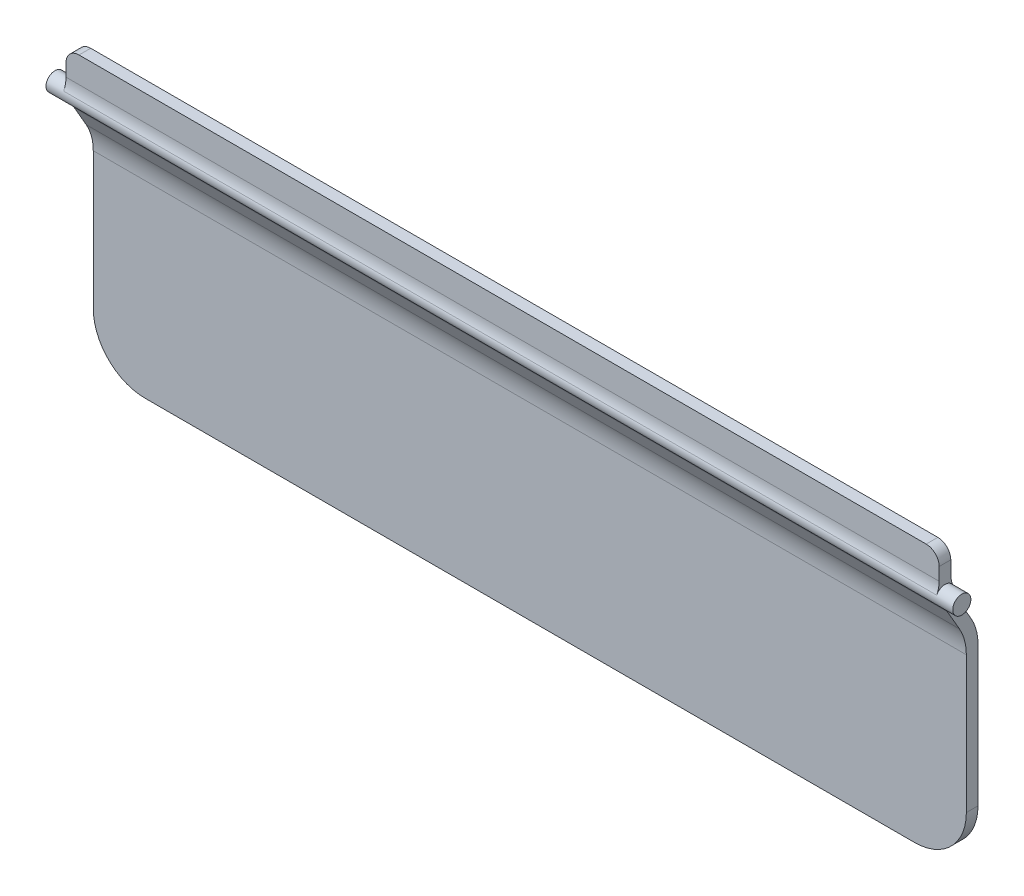
ISO-10303-21;
HEADER;
FILE_DESCRIPTION(('STEP AP214'),'2;1');
FILE_NAME('part.step','',(''),(''),'','','');
FILE_SCHEMA(('AUTOMOTIVE_DESIGN { 1 0 10303 214 1 1 1 1 }'));
ENDSEC;
DATA;
#1=APPLICATION_CONTEXT('core data for automotive mechanical design processes');
#2=APPLICATION_PROTOCOL_DEFINITION('international standard','automotive_design',2000,#1);
#3=PRODUCT_CONTEXT('',#1,'mechanical');
#4=PRODUCT('Part','Part','',(#3));
#5=PRODUCT_RELATED_PRODUCT_CATEGORY('part','',(#4));
#6=PRODUCT_DEFINITION_FORMATION('','',#4);
#7=PRODUCT_DEFINITION_CONTEXT('part definition',#1,'design');
#8=PRODUCT_DEFINITION('design','',#6,#7);
#9=PRODUCT_DEFINITION_SHAPE('','',#8);
#10=(LENGTH_UNIT() NAMED_UNIT(*) SI_UNIT(.MILLI.,.METRE.));
#11=(NAMED_UNIT(*) PLANE_ANGLE_UNIT() SI_UNIT($,.RADIAN.));
#12=(NAMED_UNIT(*) SI_UNIT($,.STERADIAN.) SOLID_ANGLE_UNIT());
#13=UNCERTAINTY_MEASURE_WITH_UNIT(LENGTH_MEASURE(1.E-05),#10,'distance_accuracy_value','');
#14=(GEOMETRIC_REPRESENTATION_CONTEXT(3) GLOBAL_UNCERTAINTY_ASSIGNED_CONTEXT((#13)) GLOBAL_UNIT_ASSIGNED_CONTEXT((#10,
#11,#12)) REPRESENTATION_CONTEXT('',''));
#15=CARTESIAN_POINT('',(0.,0.,0.));
#16=DIRECTION('',(0.,0.,1.));
#17=DIRECTION('',(1.,0.,0.));
#18=AXIS2_PLACEMENT_3D('',#15,#16,#17);
#19=CARTESIAN_POINT('',(168.5,22.5442286340599,7.49999999999999));
#20=DIRECTION('',(0.,0.500000000000001,-0.866025403784438));
#21=DIRECTION('',(0.,0.866025403784438,0.500000000000001));
#22=AXIS2_PLACEMENT_3D('',#19,#20,#21);
#23=PLANE('',#22);
#24=DIRECTION('',(0.,-0.866025403784438,-0.500000000000001));
#25=VECTOR('',#24,1.);
#26=CARTESIAN_POINT('',(168.5,22.5442286340599,7.49999999999999));
#27=LINE('',#26,#25);
#28=CARTESIAN_POINT('',(168.5,17.1088033152716,4.36185572903742));
#29=VERTEX_POINT('',#28);
#30=CARTESIAN_POINT('',(168.5,8.99871130596436,-0.320508075688754));
#31=VERTEX_POINT('',#30);
#32=EDGE_CURVE('E406',#29,#31,#27,.T.);
#33=ORIENTED_EDGE('',*,*,#32,.F.);
#34=DIRECTION('',(1.,0.,0.));
#35=VECTOR('',#34,1.);
#36=CARTESIAN_POINT('',(-168.5,17.1088033152716,4.36185572903742));
#37=LINE('',#36,#35);
#38=CARTESIAN_POINT('',(-168.5,17.1088033152716,4.36185572903742));
#39=VERTEX_POINT('',#38);
#40=EDGE_CURVE('E313',#29,#39,#37,.F.);
#41=ORIENTED_EDGE('',*,*,#40,.T.);
#42=DIRECTION('',(0.,-0.866025403784438,-0.500000000000001));
#43=VECTOR('',#42,1.);
#44=CARTESIAN_POINT('',(-168.5,22.5442286340599,7.49999999999999));
#45=LINE('',#44,#43);
#46=CARTESIAN_POINT('',(-168.5,8.99871130596436,-0.320508075688754));
#47=VERTEX_POINT('',#46);
#48=EDGE_CURVE('E217',#39,#47,#45,.T.);
#49=ORIENTED_EDGE('',*,*,#48,.T.);
#50=DIRECTION('',(-1.,0.,0.));
#51=VECTOR('',#50,1.);
#52=CARTESIAN_POINT('',(168.5,8.99871130596435,-0.320508075688753));
#53=LINE('',#52,#51);
#54=EDGE_CURVE('E191',#47,#31,#53,.F.);
#55=ORIENTED_EDGE('',*,*,#54,.T.);
#56=EDGE_LOOP('',(#33,#41,#49,#55));
#57=FACE_BOUND('',#56,.T.);
#58=ADVANCED_FACE('F45',(#57),#23,.F.);
#59=CARTESIAN_POINT('',(168.5,5.56346652052678,-7.50000000000004));
#60=DIRECTION('',(0.,-0.500000000000001,0.866025403784438));
#61=DIRECTION('',(0.,-0.866025403784438,-0.500000000000001));
#62=AXIS2_PLACEMENT_3D('',#59,#60,#61);
#63=PLANE('',#62);
#64=DIRECTION('',(0.,0.866025403784438,0.500000000000001));
#65=VECTOR('',#64,1.);
#66=CARTESIAN_POINT('',(-168.5,5.56346652052678,-7.50000000000004));
#67=LINE('',#66,#65);
#68=CARTESIAN_POINT('',(-168.5,10.2044826719043,-4.8205080756888));
#69=VERTEX_POINT('',#68);
#70=CARTESIAN_POINT('',(-168.5,19.3588033152716,0.464741412007454));
#71=VERTEX_POINT('',#70);
#72=EDGE_CURVE('E223',#69,#71,#67,.T.);
#73=ORIENTED_EDGE('',*,*,#72,.T.);
#74=DIRECTION('',(1.,0.,0.));
#75=VECTOR('',#74,1.);
#76=CARTESIAN_POINT('',(168.5,19.3588033152716,0.464741412007454));
#77=LINE('',#76,#75);
#78=CARTESIAN_POINT('',(168.5,19.3588033152716,0.464741412007454));
#79=VERTEX_POINT('',#78);
#80=EDGE_CURVE('E316',#71,#79,#77,.T.);
#81=ORIENTED_EDGE('',*,*,#80,.T.);
#82=DIRECTION('',(0.,0.866025403784438,0.500000000000001));
#83=VECTOR('',#82,1.);
#84=CARTESIAN_POINT('',(168.5,5.56346652052678,-7.50000000000004));
#85=LINE('',#84,#83);
#86=CARTESIAN_POINT('',(168.5,10.2044826719043,-4.8205080756888));
#87=VERTEX_POINT('',#86);
#88=EDGE_CURVE('E414',#87,#79,#85,.T.);
#89=ORIENTED_EDGE('',*,*,#88,.F.);
#90=DIRECTION('',(-1.,0.,0.));
#91=VECTOR('',#90,1.);
#92=CARTESIAN_POINT('',(168.5,10.2044826719043,-4.8205080756888));
#93=LINE('',#92,#91);
#94=EDGE_CURVE('E258',#87,#69,#93,.T.);
#95=ORIENTED_EDGE('',*,*,#94,.T.);
#96=EDGE_LOOP('',(#73,#81,#89,#95));
#97=FACE_BOUND('',#96,.T.);
#98=ADVANCED_FACE('F446',(#97),#63,.F.);
#99=CARTESIAN_POINT('',(168.5,0.,0.));
#100=DIRECTION('',(1.,0.,0.));
#101=DIRECTION('',(0.,0.,-1.));
#102=AXIS2_PLACEMENT_3D('',#99,#100,#101);
#103=PLANE('',#102);
#104=DIRECTION('',(0.,1.,0.));
#105=VECTOR('',#104,1.);
#106=CARTESIAN_POINT('',(168.5,-73.75,-7.5));
#107=LINE('',#106,#105);
#108=CARTESIAN_POINT('',(168.5,-53.75,-7.50000000000001));
#109=VERTEX_POINT('',#108);
#110=CARTESIAN_POINT('',(168.5,0.204482671904302,-7.50000000000003));
#111=VERTEX_POINT('',#110);
#112=EDGE_CURVE('E410',#109,#111,#107,.T.);
#113=ORIENTED_EDGE('',*,*,#112,.T.);
#114=CARTESIAN_POINT('',(168.5,0.204482671904307,12.5));
#115=DIRECTION('',(1.,0.,0.));
#116=DIRECTION('',(0.,0.,-1.));
#117=AXIS2_PLACEMENT_3D('',#114,#115,#116);
#118=CIRCLE('',#117,20.);
#119=EDGE_CURVE('E279',#111,#87,#118,.T.);
#120=ORIENTED_EDGE('',*,*,#119,.T.);
#121=ORIENTED_EDGE('',*,*,#88,.T.);
#122=CARTESIAN_POINT('',(168.5,24.3588033152716,-8.19551262583693));
#123=DIRECTION('',(1.,0.,0.));
#124=DIRECTION('',(0.,0.,-1.));
#125=AXIS2_PLACEMENT_3D('',#122,#123,#124);
#126=CIRCLE('',#125,10.);
#127=CARTESIAN_POINT('',(168.5,23.4612559091667,1.7641263562645));
#128=VERTEX_POINT('',#127);
#129=EDGE_CURVE('E339',#79,#128,#126,.F.);
#130=ORIENTED_EDGE('',*,*,#129,.T.);
#131=CARTESIAN_POINT('',(168.5,23.14711431703,5.25));
#132=DIRECTION('',(1.,0.,0.));
#133=DIRECTION('',(0.,0.,-1.));
#134=AXIS2_PLACEMENT_3D('',#131,#132,#133);
#135=CIRCLE('',#134,3.5);
#136=CARTESIAN_POINT('',(168.5,20.2853299832408,7.26499142104343));
#137=VERTEX_POINT('',#136);
#138=EDGE_CURVE('E382',#128,#137,#135,.F.);
#139=ORIENTED_EDGE('',*,*,#138,.T.);
#140=CARTESIAN_POINT('',(168.5,12.1088033152716,13.0221097668818));
#141=DIRECTION('',(1.,0.,0.));
#142=DIRECTION('',(0.,0.,-1.));
#143=AXIS2_PLACEMENT_3D('',#140,#141,#142);
#144=CIRCLE('',#143,10.);
#145=EDGE_CURVE('E330',#137,#29,#144,.F.);
#146=ORIENTED_EDGE('',*,*,#145,.T.);
#147=ORIENTED_EDGE('',*,*,#32,.T.);
#148=CARTESIAN_POINT('',(168.5,-1.00128869403567,17.));
#149=DIRECTION('',(1.,0.,0.));
#150=DIRECTION('',(0.,0.,-1.));
#151=AXIS2_PLACEMENT_3D('',#148,#149,#150);
#152=CIRCLE('',#151,20.);
#153=CARTESIAN_POINT('',(168.5,-1.00128869403567,-2.99999999999999));
#154=VERTEX_POINT('',#153);
#155=EDGE_CURVE('E196',#31,#154,#152,.F.);
#156=ORIENTED_EDGE('',*,*,#155,.T.);
#157=DIRECTION('',(0.,-1.,0.));
#158=VECTOR('',#157,1.);
#159=CARTESIAN_POINT('',(168.5,4.35769515458681,-2.99999999999999));
#160=LINE('',#159,#158);
#161=CARTESIAN_POINT('',(168.5,-53.75,-3.));
#162=VERTEX_POINT('',#161);
#163=EDGE_CURVE('E206',#154,#162,#160,.T.);
#164=ORIENTED_EDGE('',*,*,#163,.T.);
#165=DIRECTION('',(0.,0.,-1.));
#166=VECTOR('',#165,1.);
#167=CARTESIAN_POINT('',(168.5,-53.75,-7.5));
#168=LINE('',#167,#166);
#169=EDGE_CURVE('E275',#162,#109,#168,.T.);
#170=ORIENTED_EDGE('',*,*,#169,.T.);
#171=EDGE_LOOP('',(#113,#120,#121,#130,#139,#146,#147,#156,#164,#170));
#172=FACE_BOUND('',#171,.T.);
#173=ADVANCED_FACE('F451',(#172),#103,.T.);
#174=CARTESIAN_POINT('',(-168.5,0.,0.));
#175=DIRECTION('',(1.,0.,0.));
#176=DIRECTION('',(0.,0.,-1.));
#177=AXIS2_PLACEMENT_3D('',#174,#175,#176);
#178=PLANE('',#177);
#179=ORIENTED_EDGE('',*,*,#72,.F.);
#180=CARTESIAN_POINT('',(-168.5,0.204482671904307,12.5));
#181=DIRECTION('',(1.,0.,0.));
#182=DIRECTION('',(0.,0.,-1.));
#183=AXIS2_PLACEMENT_3D('',#180,#181,#182);
#184=CIRCLE('',#183,20.);
#185=CARTESIAN_POINT('',(-168.5,0.204482671904302,-7.50000000000003));
#186=VERTEX_POINT('',#185);
#187=EDGE_CURVE('E264',#69,#186,#184,.F.);
#188=ORIENTED_EDGE('',*,*,#187,.T.);
#189=DIRECTION('',(0.,1.,0.));
#190=VECTOR('',#189,1.);
#191=CARTESIAN_POINT('',(-168.5,-73.75,-7.5));
#192=LINE('',#191,#190);
#193=CARTESIAN_POINT('',(-168.5,-53.75,-7.50000000000001));
#194=VERTEX_POINT('',#193);
#195=EDGE_CURVE('E216',#194,#186,#192,.T.);
#196=ORIENTED_EDGE('',*,*,#195,.F.);
#197=DIRECTION('',(0.,0.,-1.));
#198=VECTOR('',#197,1.);
#199=CARTESIAN_POINT('',(-168.5,-53.75,0.));
#200=LINE('',#199,#198);
#201=CARTESIAN_POINT('',(-168.5,-53.75,-3.));
#202=VERTEX_POINT('',#201);
#203=EDGE_CURVE('E214',#194,#202,#200,.F.);
#204=ORIENTED_EDGE('',*,*,#203,.T.);
#205=DIRECTION('',(0.,-1.,0.));
#206=VECTOR('',#205,1.);
#207=CARTESIAN_POINT('',(-168.5,4.35769515458681,-2.99999999999999));
#208=LINE('',#207,#206);
#209=CARTESIAN_POINT('',(-168.5,-1.00128869403567,-2.99999999999999));
#210=VERTEX_POINT('',#209);
#211=EDGE_CURVE('E203',#210,#202,#208,.T.);
#212=ORIENTED_EDGE('',*,*,#211,.F.);
#213=CARTESIAN_POINT('',(-168.5,-1.00128869403567,17.));
#214=DIRECTION('',(1.,0.,0.));
#215=DIRECTION('',(0.,0.,-1.));
#216=AXIS2_PLACEMENT_3D('',#213,#214,#215);
#217=CIRCLE('',#216,20.);
#218=EDGE_CURVE('E185',#210,#47,#217,.T.);
#219=ORIENTED_EDGE('',*,*,#218,.T.);
#220=ORIENTED_EDGE('',*,*,#48,.F.);
#221=CARTESIAN_POINT('',(-168.5,12.1088033152716,13.0221097668818));
#222=DIRECTION('',(1.,0.,0.));
#223=DIRECTION('',(0.,0.,-1.));
#224=AXIS2_PLACEMENT_3D('',#221,#222,#223);
#225=CIRCLE('',#224,10.);
#226=CARTESIAN_POINT('',(-168.5,20.2853299832408,7.26499142104343));
#227=VERTEX_POINT('',#226);
#228=EDGE_CURVE('E332',#39,#227,#225,.T.);
#229=ORIENTED_EDGE('',*,*,#228,.T.);
#230=CARTESIAN_POINT('',(-168.5,23.14711431703,5.25));
#231=DIRECTION('',(1.,0.,0.));
#232=DIRECTION('',(0.,0.,-1.));
#233=AXIS2_PLACEMENT_3D('',#230,#231,#232);
#234=CIRCLE('',#233,3.5);
#235=CARTESIAN_POINT('',(-168.5,23.4612559091667,1.7641263562645));
#236=VERTEX_POINT('',#235);
#237=EDGE_CURVE('E250',#236,#227,#234,.F.);
#238=ORIENTED_EDGE('',*,*,#237,.F.);
#239=CARTESIAN_POINT('',(-168.5,24.3588033152716,-8.19551262583693));
#240=DIRECTION('',(1.,0.,0.));
#241=DIRECTION('',(0.,0.,-1.));
#242=AXIS2_PLACEMENT_3D('',#239,#240,#241);
#243=CIRCLE('',#242,10.);
#244=EDGE_CURVE('E336',#236,#71,#243,.T.);
#245=ORIENTED_EDGE('',*,*,#244,.T.);
#246=EDGE_LOOP('',(#179,#188,#196,#204,#212,#219,#220,#229,#238,#245));
#247=FACE_BOUND('',#246,.T.);
#248=ADVANCED_FACE('F211',(#247),#178,.F.);
#249=CARTESIAN_POINT('',(168.5,4.35769515458681,-2.99999999999999));
#250=DIRECTION('',(0.,0.,-1.));
#251=DIRECTION('',(0.,1.,0.));
#252=AXIS2_PLACEMENT_3D('',#249,#250,#251);
#253=PLANE('',#252);
#254=ORIENTED_EDGE('',*,*,#163,.F.);
#255=DIRECTION('',(-1.,0.,0.));
#256=VECTOR('',#255,1.);
#257=CARTESIAN_POINT('',(-168.5,-1.00128869403567,-2.99999999999999));
#258=LINE('',#257,#256);
#259=EDGE_CURVE('E189',#154,#210,#258,.T.);
#260=ORIENTED_EDGE('',*,*,#259,.T.);
#261=ORIENTED_EDGE('',*,*,#211,.T.);
#262=CARTESIAN_POINT('',(-148.5,-53.75,-3.));
#263=DIRECTION('',(0.,0.,-1.));
#264=DIRECTION('',(0.,1.,0.));
#265=AXIS2_PLACEMENT_3D('',#262,#263,#264);
#266=CIRCLE('',#265,20.);
#267=CARTESIAN_POINT('',(-148.5,-73.75,-3.));
#268=VERTEX_POINT('',#267);
#269=EDGE_CURVE('E251',#202,#268,#266,.F.);
#270=ORIENTED_EDGE('',*,*,#269,.T.);
#271=DIRECTION('',(-1.,0.,0.));
#272=VECTOR('',#271,1.);
#273=CARTESIAN_POINT('',(168.5,-73.75,-3.));
#274=LINE('',#273,#272);
#275=CARTESIAN_POINT('',(148.5,-73.75,-3.));
#276=VERTEX_POINT('',#275);
#277=EDGE_CURVE('E242',#276,#268,#274,.T.);
#278=ORIENTED_EDGE('',*,*,#277,.F.);
#279=CARTESIAN_POINT('',(148.5,-53.75,-3.));
#280=DIRECTION('',(0.,0.,-1.));
#281=DIRECTION('',(0.,1.,0.));
#282=AXIS2_PLACEMENT_3D('',#279,#280,#281);
#283=CIRCLE('',#282,20.);
#284=EDGE_CURVE('E208',#276,#162,#283,.F.);
#285=ORIENTED_EDGE('',*,*,#284,.T.);
#286=EDGE_LOOP('',(#254,#260,#261,#270,#278,#285));
#287=FACE_BOUND('',#286,.T.);
#288=ADVANCED_FACE('F202',(#287),#253,.F.);
#289=CARTESIAN_POINT('',(168.5,-73.75,-3.));
#290=DIRECTION('',(0.,1.,0.));
#291=DIRECTION('',(0.,0.,1.));
#292=AXIS2_PLACEMENT_3D('',#289,#290,#291);
#293=PLANE('',#292);
#294=DIRECTION('',(-1.,0.,0.));
#295=VECTOR('',#294,1.);
#296=CARTESIAN_POINT('',(168.5,-73.75,-7.5));
#297=LINE('',#296,#295);
#298=CARTESIAN_POINT('',(148.5,-73.75,-7.5));
#299=VERTEX_POINT('',#298);
#300=CARTESIAN_POINT('',(-148.5,-73.75,-7.5));
#301=VERTEX_POINT('',#300);
#302=EDGE_CURVE('E238',#299,#301,#297,.T.);
#303=ORIENTED_EDGE('',*,*,#302,.F.);
#304=DIRECTION('',(0.,0.,-1.));
#305=VECTOR('',#304,1.);
#306=CARTESIAN_POINT('',(148.5,-73.75,-3.));
#307=LINE('',#306,#305);
#308=EDGE_CURVE('E197',#299,#276,#307,.F.);
#309=ORIENTED_EDGE('',*,*,#308,.T.);
#310=ORIENTED_EDGE('',*,*,#277,.T.);
#311=DIRECTION('',(0.,0.,-1.));
#312=VECTOR('',#311,1.);
#313=CARTESIAN_POINT('',(-148.5,-73.75,-3.));
#314=LINE('',#313,#312);
#315=EDGE_CURVE('E282',#268,#301,#314,.T.);
#316=ORIENTED_EDGE('',*,*,#315,.T.);
#317=EDGE_LOOP('',(#303,#309,#310,#316));
#318=FACE_BOUND('',#317,.T.);
#319=ADVANCED_FACE('F500',(#318),#293,.F.);
#320=CARTESIAN_POINT('',(168.5,-73.75,-7.5));
#321=DIRECTION('',(0.,0.,1.));
#322=DIRECTION('',(0.,-1.,0.));
#323=AXIS2_PLACEMENT_3D('',#320,#321,#322);
#324=PLANE('',#323);
#325=ORIENTED_EDGE('',*,*,#195,.T.);
#326=DIRECTION('',(-1.,0.,0.));
#327=VECTOR('',#326,1.);
#328=CARTESIAN_POINT('',(168.5,0.204482671904302,-7.50000000000003));
#329=LINE('',#328,#327);
#330=EDGE_CURVE('E272',#186,#111,#329,.F.);
#331=ORIENTED_EDGE('',*,*,#330,.T.);
#332=ORIENTED_EDGE('',*,*,#112,.F.);
#333=CARTESIAN_POINT('',(148.5,-53.75,-7.50000000000001));
#334=DIRECTION('',(0.,0.,1.));
#335=DIRECTION('',(0.,-1.,0.));
#336=AXIS2_PLACEMENT_3D('',#333,#334,#335);
#337=CIRCLE('',#336,20.);
#338=EDGE_CURVE('E270',#109,#299,#337,.F.);
#339=ORIENTED_EDGE('',*,*,#338,.T.);
#340=ORIENTED_EDGE('',*,*,#302,.T.);
#341=CARTESIAN_POINT('',(-148.5,-53.75,-7.50000000000001));
#342=DIRECTION('',(0.,0.,1.));
#343=DIRECTION('',(0.,-1.,0.));
#344=AXIS2_PLACEMENT_3D('',#341,#342,#343);
#345=CIRCLE('',#344,20.);
#346=EDGE_CURVE('E267',#301,#194,#345,.F.);
#347=ORIENTED_EDGE('',*,*,#346,.T.);
#348=EDGE_LOOP('',(#325,#331,#332,#339,#340,#347));
#349=FACE_BOUND('',#348,.T.);
#350=ADVANCED_FACE('F495',(#349),#324,.F.);
#351=CARTESIAN_POINT('',(175.,23.14711431703,5.25));
#352=DIRECTION('',(-1.,0.,0.));
#353=DIRECTION('',(0.,0.,1.));
#354=AXIS2_PLACEMENT_3D('',#351,#352,#353);
#355=CYLINDRICAL_SURFACE('',#354,3.5);
#356=DIRECTION('',(-1.,0.,0.));
#357=VECTOR('',#356,1.);
#358=CARTESIAN_POINT('',(175.,20.2853299832408,7.26499142104343));
#359=LINE('',#358,#357);
#360=EDGE_CURVE('E301',#227,#137,#359,.F.);
#361=ORIENTED_EDGE('',*,*,#360,.T.);
#362=ORIENTED_EDGE('',*,*,#138,.F.);
#363=DIRECTION('',(-1.,0.,0.));
#364=VECTOR('',#363,1.);
#365=CARTESIAN_POINT('',(175.,23.4612559091667,1.7641263562645));
#366=LINE('',#365,#364);
#367=EDGE_CURVE('E297',#128,#236,#366,.T.);
#368=ORIENTED_EDGE('',*,*,#367,.T.);
#369=ORIENTED_EDGE('',*,*,#237,.T.);
#370=EDGE_LOOP('',(#361,#362,#368,#369));
#371=FACE_BOUND('',#370,.T.);
#372=DIRECTION('',(-1.,0.,0.));
#373=VECTOR('',#372,1.);
#374=CARTESIAN_POINT('',(175.,24.617996539722,8.42592592592592));
#375=LINE('',#374,#373);
#376=CARTESIAN_POINT('',(168.5,24.617996539722,8.42592592592592));
#377=VERTEX_POINT('',#376);
#378=CARTESIAN_POINT('',(-168.5,24.617996539722,8.42592592592592));
#379=VERTEX_POINT('',#378);
#380=EDGE_CURVE('E305',#377,#379,#375,.T.);
#381=ORIENTED_EDGE('',*,*,#380,.T.);
#382=CARTESIAN_POINT('',(-168.5,24.617996539722,2.07407407407407));
#383=VERTEX_POINT('',#382);
#384=EDGE_CURVE('E247',#379,#383,#234,.F.);
#385=ORIENTED_EDGE('',*,*,#384,.T.);
#386=DIRECTION('',(-1.,0.,0.));
#387=VECTOR('',#386,1.);
#388=CARTESIAN_POINT('',(175.,24.617996539722,2.07407407407407));
#389=LINE('',#388,#387);
#390=CARTESIAN_POINT('',(168.5,24.617996539722,2.07407407407407));
#391=VERTEX_POINT('',#390);
#392=EDGE_CURVE('E293',#383,#391,#389,.F.);
#393=ORIENTED_EDGE('',*,*,#392,.T.);
#394=EDGE_CURVE('E400',#377,#391,#135,.F.);
#395=ORIENTED_EDGE('',*,*,#394,.F.);
#396=EDGE_LOOP('',(#381,#385,#393,#395));
#397=FACE_BOUND('',#396,.T.);
#398=CARTESIAN_POINT('',(175.,23.14711431703,5.25));
#399=DIRECTION('',(1.,0.,0.));
#400=DIRECTION('',(0.,0.,-1.));
#401=AXIS2_PLACEMENT_3D('',#398,#399,#400);
#402=CIRCLE('',#401,3.5);
#403=CARTESIAN_POINT('',(175.,23.14711431703,1.75));
#404=VERTEX_POINT('',#403);
#405=EDGE_CURVE('E395',#404,#404,#402,.T.);
#406=ORIENTED_EDGE('',*,*,#405,.F.);
#407=EDGE_LOOP('',(#406));
#408=FACE_BOUND('',#407,.T.);
#409=CARTESIAN_POINT('',(-175.,23.14711431703,5.25));
#410=DIRECTION('',(1.,0.,0.));
#411=DIRECTION('',(0.,0.,-1.));
#412=AXIS2_PLACEMENT_3D('',#409,#410,#411);
#413=CIRCLE('',#412,3.5);
#414=CARTESIAN_POINT('',(-175.,23.14711431703,1.75));
#415=VERTEX_POINT('',#414);
#416=EDGE_CURVE('E391',#415,#415,#413,.T.);
#417=ORIENTED_EDGE('',*,*,#416,.T.);
#418=EDGE_LOOP('',(#417));
#419=FACE_BOUND('',#418,.T.);
#420=ADVANCED_FACE('F430',(#371,#397,#408,#419),#355,.T.);
#421=CARTESIAN_POINT('',(175.,23.14711431703,5.25));
#422=DIRECTION('',(1.,0.,0.));
#423=DIRECTION('',(0.,0.,-1.));
#424=AXIS2_PLACEMENT_3D('',#421,#422,#423);
#425=PLANE('',#424);
#426=ORIENTED_EDGE('',*,*,#405,.T.);
#427=EDGE_LOOP('',(#426));
#428=FACE_BOUND('',#427,.T.);
#429=ADVANCED_FACE('F520',(#428),#425,.T.);
#430=CARTESIAN_POINT('',(-175.,23.14711431703,5.25));
#431=DIRECTION('',(1.,0.,0.));
#432=DIRECTION('',(0.,0.,-1.));
#433=AXIS2_PLACEMENT_3D('',#430,#431,#432);
#434=PLANE('',#433);
#435=ORIENTED_EDGE('',*,*,#416,.F.);
#436=EDGE_LOOP('',(#435));
#437=FACE_BOUND('',#436,.T.);
#438=ADVANCED_FACE('F517',(#437),#434,.F.);
#439=DIRECTION('',(0.,1.,0.));
#440=VECTOR('',#439,1.);
#441=CARTESIAN_POINT('',(168.5,23.75,3.));
#442=LINE('',#441,#440);
#443=CARTESIAN_POINT('',(168.5,28.8205171759851,3.));
#444=VERTEX_POINT('',#443);
#445=CARTESIAN_POINT('',(168.5,33.75,3.));
#446=VERTEX_POINT('',#445);
#447=EDGE_CURVE('E243',#444,#446,#442,.T.);
#448=ORIENTED_EDGE('',*,*,#447,.T.);
#449=DIRECTION('',(0.,0.,-1.));
#450=VECTOR('',#449,1.);
#451=CARTESIAN_POINT('',(168.5,33.75,7.5));
#452=LINE('',#451,#450);
#453=CARTESIAN_POINT('',(168.5,33.75,7.5));
#454=VERTEX_POINT('',#453);
#455=EDGE_CURVE('E11',#446,#454,#452,.F.);
#456=ORIENTED_EDGE('',*,*,#455,.T.);
#457=DIRECTION('',(0.,-1.,0.));
#458=VECTOR('',#457,1.);
#459=CARTESIAN_POINT('',(168.5,73.75,7.5));
#460=LINE('',#459,#458);
#461=CARTESIAN_POINT('',(168.5,28.8205171759851,7.49999999999999));
#462=VERTEX_POINT('',#461);
#463=EDGE_CURVE('E237',#454,#462,#460,.T.);
#464=ORIENTED_EDGE('',*,*,#463,.T.);
#465=CARTESIAN_POINT('',(168.5,28.8205171759851,17.5));
#466=DIRECTION('',(1.,0.,0.));
#467=DIRECTION('',(0.,0.,-1.));
#468=AXIS2_PLACEMENT_3D('',#465,#466,#467);
#469=CIRCLE('',#468,10.);
#470=EDGE_CURVE('E326',#462,#377,#469,.F.);
#471=ORIENTED_EDGE('',*,*,#470,.T.);
#472=ORIENTED_EDGE('',*,*,#394,.T.);
#473=CARTESIAN_POINT('',(168.5,28.8205171759851,-7.));
#474=DIRECTION('',(1.,0.,0.));
#475=DIRECTION('',(0.,0.,-1.));
#476=AXIS2_PLACEMENT_3D('',#473,#474,#475);
#477=CIRCLE('',#476,10.);
#478=EDGE_CURVE('E343',#391,#444,#477,.F.);
#479=ORIENTED_EDGE('',*,*,#478,.T.);
#480=EDGE_LOOP('',(#448,#456,#464,#471,#472,#479));
#481=FACE_BOUND('',#480,.T.);
#482=ADVANCED_FACE('F420',(#481),#103,.T.);
#483=DIRECTION('',(0.,-1.,0.));
#484=VECTOR('',#483,1.);
#485=CARTESIAN_POINT('',(-168.5,73.75,7.5));
#486=LINE('',#485,#484);
#487=CARTESIAN_POINT('',(-168.5,33.75,7.5));
#488=VERTEX_POINT('',#487);
#489=CARTESIAN_POINT('',(-168.5,28.8205171759851,7.49999999999999));
#490=VERTEX_POINT('',#489);
#491=EDGE_CURVE('E226',#488,#490,#486,.T.);
#492=ORIENTED_EDGE('',*,*,#491,.F.);
#493=DIRECTION('',(0.,0.,-1.));
#494=VECTOR('',#493,1.);
#495=CARTESIAN_POINT('',(-168.5,33.75,0.));
#496=LINE('',#495,#494);
#497=CARTESIAN_POINT('',(-168.5,33.75,3.));
#498=VERTEX_POINT('',#497);
#499=EDGE_CURVE('E350',#488,#498,#496,.T.);
#500=ORIENTED_EDGE('',*,*,#499,.T.);
#501=DIRECTION('',(0.,1.,0.));
#502=VECTOR('',#501,1.);
#503=CARTESIAN_POINT('',(-168.5,23.75,3.));
#504=LINE('',#503,#502);
#505=CARTESIAN_POINT('',(-168.5,28.8205171759851,3.));
#506=VERTEX_POINT('',#505);
#507=EDGE_CURVE('E233',#506,#498,#504,.T.);
#508=ORIENTED_EDGE('',*,*,#507,.F.);
#509=CARTESIAN_POINT('',(-168.5,28.8205171759851,-7.));
#510=DIRECTION('',(1.,0.,0.));
#511=DIRECTION('',(0.,0.,-1.));
#512=AXIS2_PLACEMENT_3D('',#509,#510,#511);
#513=CIRCLE('',#512,10.);
#514=EDGE_CURVE('E346',#506,#383,#513,.T.);
#515=ORIENTED_EDGE('',*,*,#514,.T.);
#516=ORIENTED_EDGE('',*,*,#384,.F.);
#517=CARTESIAN_POINT('',(-168.5,28.8205171759851,17.5));
#518=DIRECTION('',(1.,0.,0.));
#519=DIRECTION('',(0.,0.,-1.));
#520=AXIS2_PLACEMENT_3D('',#517,#518,#519);
#521=CIRCLE('',#520,10.);
#522=EDGE_CURVE('E322',#379,#490,#521,.T.);
#523=ORIENTED_EDGE('',*,*,#522,.T.);
#524=EDGE_LOOP('',(#492,#500,#508,#515,#516,#523));
#525=FACE_BOUND('',#524,.T.);
#526=ADVANCED_FACE('F377',(#525),#178,.F.);
#527=CARTESIAN_POINT('',(168.5,23.75,3.));
#528=DIRECTION('',(0.,0.,1.));
#529=DIRECTION('',(0.,-1.,0.));
#530=AXIS2_PLACEMENT_3D('',#527,#528,#529);
#531=PLANE('',#530);
#532=ORIENTED_EDGE('',*,*,#507,.T.);
#533=CARTESIAN_POINT('',(-163.5,33.75,3.));
#534=DIRECTION('',(0.,0.,1.));
#535=DIRECTION('',(0.,-1.,0.));
#536=AXIS2_PLACEMENT_3D('',#533,#534,#535);
#537=CIRCLE('',#536,5.);
#538=CARTESIAN_POINT('',(-163.5,38.75,3.));
#539=VERTEX_POINT('',#538);
#540=EDGE_CURVE('E357',#498,#539,#537,.F.);
#541=ORIENTED_EDGE('',*,*,#540,.T.);
#542=DIRECTION('',(-1.,0.,0.));
#543=VECTOR('',#542,1.);
#544=CARTESIAN_POINT('',(168.5,38.75,3.));
#545=LINE('',#544,#543);
#546=CARTESIAN_POINT('',(163.5,38.75,3.));
#547=VERTEX_POINT('',#546);
#548=EDGE_CURVE('E387',#547,#539,#545,.T.);
#549=ORIENTED_EDGE('',*,*,#548,.F.);
#550=CARTESIAN_POINT('',(163.5,33.75,3.));
#551=DIRECTION('',(0.,0.,1.));
#552=DIRECTION('',(0.,-1.,0.));
#553=AXIS2_PLACEMENT_3D('',#550,#551,#552);
#554=CIRCLE('',#553,5.);
#555=EDGE_CURVE('E354',#547,#446,#554,.F.);
#556=ORIENTED_EDGE('',*,*,#555,.T.);
#557=ORIENTED_EDGE('',*,*,#447,.F.);
#558=DIRECTION('',(1.,0.,0.));
#559=VECTOR('',#558,1.);
#560=CARTESIAN_POINT('',(-168.5,28.8205171759851,3.));
#561=LINE('',#560,#559);
#562=EDGE_CURVE('E319',#444,#506,#561,.F.);
#563=ORIENTED_EDGE('',*,*,#562,.T.);
#564=EDGE_LOOP('',(#532,#541,#549,#556,#557,#563));
#565=FACE_BOUND('',#564,.T.);
#566=ADVANCED_FACE('F386',(#565),#531,.F.);
#567=CARTESIAN_POINT('',(168.5,73.75,7.5));
#568=DIRECTION('',(0.,0.,-1.));
#569=DIRECTION('',(0.,1.,0.));
#570=AXIS2_PLACEMENT_3D('',#567,#568,#569);
#571=PLANE('',#570);
#572=DIRECTION('',(-1.,0.,0.));
#573=VECTOR('',#572,1.);
#574=CARTESIAN_POINT('',(168.5,38.75,7.5));
#575=LINE('',#574,#573);
#576=CARTESIAN_POINT('',(163.5,38.75,7.5));
#577=VERTEX_POINT('',#576);
#578=CARTESIAN_POINT('',(-163.5,38.75,7.5));
#579=VERTEX_POINT('',#578);
#580=EDGE_CURVE('E290',#577,#579,#575,.T.);
#581=ORIENTED_EDGE('',*,*,#580,.T.);
#582=CARTESIAN_POINT('',(-163.5,33.75,7.5));
#583=DIRECTION('',(0.,0.,-1.));
#584=DIRECTION('',(0.,1.,0.));
#585=AXIS2_PLACEMENT_3D('',#582,#583,#584);
#586=CIRCLE('',#585,5.);
#587=EDGE_CURVE('E54',#579,#488,#586,.F.);
#588=ORIENTED_EDGE('',*,*,#587,.T.);
#589=ORIENTED_EDGE('',*,*,#491,.T.);
#590=DIRECTION('',(1.,0.,0.));
#591=VECTOR('',#590,1.);
#592=CARTESIAN_POINT('',(168.5,28.8205171759851,7.49999999999999));
#593=LINE('',#592,#591);
#594=EDGE_CURVE('E309',#490,#462,#593,.T.);
#595=ORIENTED_EDGE('',*,*,#594,.T.);
#596=ORIENTED_EDGE('',*,*,#463,.F.);
#597=CARTESIAN_POINT('',(163.5,33.75,7.49999999999999));
#598=DIRECTION('',(0.,0.,-1.));
#599=DIRECTION('',(0.,1.,0.));
#600=AXIS2_PLACEMENT_3D('',#597,#598,#599);
#601=CIRCLE('',#600,5.);
#602=EDGE_CURVE('E366',#454,#577,#601,.F.);
#603=ORIENTED_EDGE('',*,*,#602,.T.);
#604=EDGE_LOOP('',(#581,#588,#589,#595,#596,#603));
#605=FACE_BOUND('',#604,.T.);
#606=ADVANCED_FACE('F373',(#605),#571,.F.);
#607=CARTESIAN_POINT('',(168.5,-1.00128869403567,17.));
#608=DIRECTION('',(1.,0.,0.));
#609=DIRECTION('',(0.,0.,-1.));
#610=AXIS2_PLACEMENT_3D('',#607,#608,#609);
#611=CYLINDRICAL_SURFACE('',#610,20.);
#612=ORIENTED_EDGE('',*,*,#155,.F.);
#613=ORIENTED_EDGE('',*,*,#54,.F.);
#614=ORIENTED_EDGE('',*,*,#218,.F.);
#615=ORIENTED_EDGE('',*,*,#259,.F.);
#616=EDGE_LOOP('',(#612,#613,#614,#615));
#617=FACE_BOUND('',#616,.T.);
#618=ADVANCED_FACE('F188',(#617),#611,.F.);
#619=CARTESIAN_POINT('',(168.5,0.204482671904307,12.5));
#620=DIRECTION('',(-1.,0.,0.));
#621=DIRECTION('',(0.,0.,1.));
#622=AXIS2_PLACEMENT_3D('',#619,#620,#621);
#623=CYLINDRICAL_SURFACE('',#622,20.);
#624=ORIENTED_EDGE('',*,*,#119,.F.);
#625=ORIENTED_EDGE('',*,*,#330,.F.);
#626=ORIENTED_EDGE('',*,*,#187,.F.);
#627=ORIENTED_EDGE('',*,*,#94,.F.);
#628=EDGE_LOOP('',(#624,#625,#626,#627));
#629=FACE_BOUND('',#628,.T.);
#630=ADVANCED_FACE('F462',(#629),#623,.T.);
#631=CARTESIAN_POINT('',(148.5,-53.75,0.));
#632=DIRECTION('',(0.,0.,1.));
#633=DIRECTION('',(1.,0.,0.));
#634=AXIS2_PLACEMENT_3D('',#631,#632,#633);
#635=CYLINDRICAL_SURFACE('',#634,20.);
#636=ORIENTED_EDGE('',*,*,#284,.F.);
#637=ORIENTED_EDGE('',*,*,#308,.F.);
#638=ORIENTED_EDGE('',*,*,#338,.F.);
#639=ORIENTED_EDGE('',*,*,#169,.F.);
#640=EDGE_LOOP('',(#636,#637,#638,#639));
#641=FACE_BOUND('',#640,.T.);
#642=ADVANCED_FACE('F465',(#641),#635,.T.);
#643=CARTESIAN_POINT('',(-148.5,-53.75,-3.));
#644=DIRECTION('',(0.,0.,-1.));
#645=DIRECTION('',(-1.,0.,0.));
#646=AXIS2_PLACEMENT_3D('',#643,#644,#645);
#647=CYLINDRICAL_SURFACE('',#646,20.);
#648=ORIENTED_EDGE('',*,*,#269,.F.);
#649=ORIENTED_EDGE('',*,*,#203,.F.);
#650=ORIENTED_EDGE('',*,*,#346,.F.);
#651=ORIENTED_EDGE('',*,*,#315,.F.);
#652=EDGE_LOOP('',(#648,#649,#650,#651));
#653=FACE_BOUND('',#652,.T.);
#654=ADVANCED_FACE('F469',(#653),#647,.T.);
#655=CARTESIAN_POINT('',(168.5,38.75,8.75));
#656=DIRECTION('',(0.,-1.,0.));
#657=DIRECTION('',(0.,0.,-1.));
#658=AXIS2_PLACEMENT_3D('',#655,#656,#657);
#659=PLANE('',#658);
#660=ORIENTED_EDGE('',*,*,#548,.T.);
#661=DIRECTION('',(0.,0.,-1.));
#662=VECTOR('',#661,1.);
#663=CARTESIAN_POINT('',(-163.5,38.75,8.75));
#664=LINE('',#663,#662);
#665=EDGE_CURVE('E67',#539,#579,#664,.F.);
#666=ORIENTED_EDGE('',*,*,#665,.T.);
#667=ORIENTED_EDGE('',*,*,#580,.F.);
#668=DIRECTION('',(0.,0.,-1.));
#669=VECTOR('',#668,1.);
#670=CARTESIAN_POINT('',(163.5,38.75,3.));
#671=LINE('',#670,#669);
#672=EDGE_CURVE('E360',#577,#547,#671,.T.);
#673=ORIENTED_EDGE('',*,*,#672,.T.);
#674=EDGE_LOOP('',(#660,#666,#667,#673));
#675=FACE_BOUND('',#674,.T.);
#676=ADVANCED_FACE('F388',(#675),#659,.F.);
#677=CARTESIAN_POINT('',(175.,28.8205171759851,17.5));
#678=DIRECTION('',(-1.,0.,0.));
#679=DIRECTION('',(0.,0.,1.));
#680=AXIS2_PLACEMENT_3D('',#677,#678,#679);
#681=CYLINDRICAL_SURFACE('',#680,10.);
#682=ORIENTED_EDGE('',*,*,#470,.F.);
#683=ORIENTED_EDGE('',*,*,#594,.F.);
#684=ORIENTED_EDGE('',*,*,#522,.F.);
#685=ORIENTED_EDGE('',*,*,#380,.F.);
#686=EDGE_LOOP('',(#682,#683,#684,#685));
#687=FACE_BOUND('',#686,.T.);
#688=ADVANCED_FACE('F428',(#687),#681,.F.);
#689=CARTESIAN_POINT('',(175.,12.1088033152716,13.0221097668818));
#690=DIRECTION('',(-1.,0.,0.));
#691=DIRECTION('',(0.,0.,1.));
#692=AXIS2_PLACEMENT_3D('',#689,#690,#691);
#693=CYLINDRICAL_SURFACE('',#692,10.);
#694=ORIENTED_EDGE('',*,*,#228,.F.);
#695=ORIENTED_EDGE('',*,*,#40,.F.);
#696=ORIENTED_EDGE('',*,*,#145,.F.);
#697=ORIENTED_EDGE('',*,*,#360,.F.);
#698=EDGE_LOOP('',(#694,#695,#696,#697));
#699=FACE_BOUND('',#698,.T.);
#700=ADVANCED_FACE('F442',(#699),#693,.F.);
#701=CARTESIAN_POINT('',(175.,24.3588033152716,-8.19551262583693));
#702=DIRECTION('',(-1.,0.,0.));
#703=DIRECTION('',(0.,0.,1.));
#704=AXIS2_PLACEMENT_3D('',#701,#702,#703);
#705=CYLINDRICAL_SURFACE('',#704,10.);
#706=ORIENTED_EDGE('',*,*,#129,.F.);
#707=ORIENTED_EDGE('',*,*,#80,.F.);
#708=ORIENTED_EDGE('',*,*,#244,.F.);
#709=ORIENTED_EDGE('',*,*,#367,.F.);
#710=EDGE_LOOP('',(#706,#707,#708,#709));
#711=FACE_BOUND('',#710,.T.);
#712=ADVANCED_FACE('F437',(#711),#705,.F.);
#713=CARTESIAN_POINT('',(175.,28.8205171759851,-7.));
#714=DIRECTION('',(-1.,0.,0.));
#715=DIRECTION('',(0.,0.,1.));
#716=AXIS2_PLACEMENT_3D('',#713,#714,#715);
#717=CYLINDRICAL_SURFACE('',#716,10.);
#718=ORIENTED_EDGE('',*,*,#514,.F.);
#719=ORIENTED_EDGE('',*,*,#562,.F.);
#720=ORIENTED_EDGE('',*,*,#478,.F.);
#721=ORIENTED_EDGE('',*,*,#392,.F.);
#722=EDGE_LOOP('',(#718,#719,#720,#721));
#723=FACE_BOUND('',#722,.T.);
#724=ADVANCED_FACE('F435',(#723),#717,.F.);
#725=CARTESIAN_POINT('',(-163.5,33.75,0.));
#726=DIRECTION('',(0.,0.,-1.));
#727=DIRECTION('',(0.,1.,0.));
#728=AXIS2_PLACEMENT_3D('',#725,#726,#727);
#729=CYLINDRICAL_SURFACE('',#728,5.);
#730=ORIENTED_EDGE('',*,*,#587,.F.);
#731=ORIENTED_EDGE('',*,*,#665,.F.);
#732=ORIENTED_EDGE('',*,*,#540,.F.);
#733=ORIENTED_EDGE('',*,*,#499,.F.);
#734=EDGE_LOOP('',(#730,#731,#732,#733));
#735=FACE_BOUND('',#734,.T.);
#736=ADVANCED_FACE('F383',(#735),#729,.T.);
#737=CARTESIAN_POINT('',(163.5,33.75,8.75));
#738=DIRECTION('',(0.,0.,1.));
#739=DIRECTION('',(0.,-1.,0.));
#740=AXIS2_PLACEMENT_3D('',#737,#738,#739);
#741=CYLINDRICAL_SURFACE('',#740,5.);
#742=ORIENTED_EDGE('',*,*,#602,.F.);
#743=ORIENTED_EDGE('',*,*,#455,.F.);
#744=ORIENTED_EDGE('',*,*,#555,.F.);
#745=ORIENTED_EDGE('',*,*,#672,.F.);
#746=EDGE_LOOP('',(#742,#743,#744,#745));
#747=FACE_BOUND('',#746,.T.);
#748=ADVANCED_FACE('F47',(#747),#741,.T.);
#749=CLOSED_SHELL('',(#58,#98,#173,#248,#288,#319,#350,#420,#429,#438,#482,#526,#566,#606,#618,
#630,#642,#654,#676,#688,#700,#712,#724,#736,#748));
#750=MANIFOLD_SOLID_BREP('B2',#749);
#751=ADVANCED_BREP_SHAPE_REPRESENTATION('',(#18,#750),#14);
#752=SHAPE_DEFINITION_REPRESENTATION(#9,#751);
ENDSEC;
END-ISO-10303-21;
